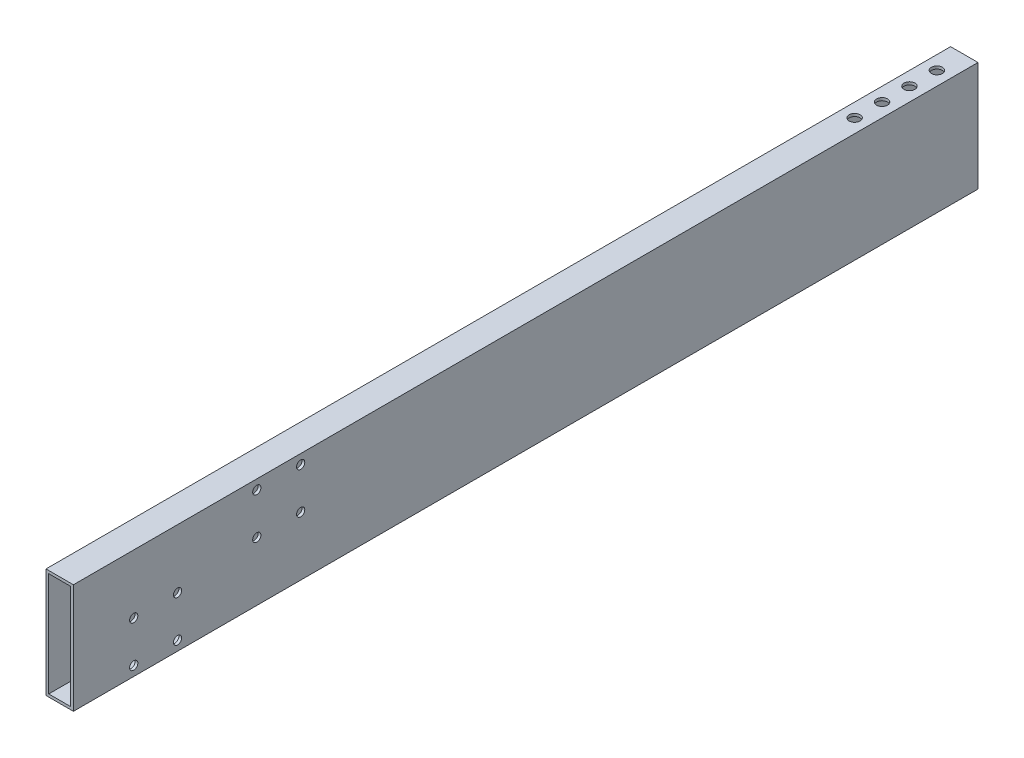
ISO-10303-21;
HEADER;
FILE_DESCRIPTION(('STEP AP214'),'2;1');
FILE_NAME('part.step','',(''),(''),'','','');
FILE_SCHEMA(('AUTOMOTIVE_DESIGN { 1 0 10303 214 1 1 1 1 }'));
ENDSEC;
DATA;
#1=APPLICATION_CONTEXT('core data for automotive mechanical design processes');
#2=APPLICATION_PROTOCOL_DEFINITION('international standard','automotive_design',2000,#1);
#3=PRODUCT_CONTEXT('',#1,'mechanical');
#4=PRODUCT('Part','Part','',(#3));
#5=PRODUCT_RELATED_PRODUCT_CATEGORY('part','',(#4));
#6=PRODUCT_DEFINITION_FORMATION('','',#4);
#7=PRODUCT_DEFINITION_CONTEXT('part definition',#1,'design');
#8=PRODUCT_DEFINITION('design','',#6,#7);
#9=PRODUCT_DEFINITION_SHAPE('','',#8);
#10=(LENGTH_UNIT() NAMED_UNIT(*) SI_UNIT(.MILLI.,.METRE.));
#11=(NAMED_UNIT(*) PLANE_ANGLE_UNIT() SI_UNIT($,.RADIAN.));
#12=(NAMED_UNIT(*) SI_UNIT($,.STERADIAN.) SOLID_ANGLE_UNIT());
#13=UNCERTAINTY_MEASURE_WITH_UNIT(LENGTH_MEASURE(1.E-05),#10,'distance_accuracy_value','');
#14=(GEOMETRIC_REPRESENTATION_CONTEXT(3) GLOBAL_UNCERTAINTY_ASSIGNED_CONTEXT((#13)) GLOBAL_UNIT_ASSIGNED_CONTEXT((#10,
#11,#12)) REPRESENTATION_CONTEXT('',''));
#15=CARTESIAN_POINT('',(0.,0.,0.));
#16=DIRECTION('',(0.,0.,1.));
#17=DIRECTION('',(1.,0.,0.));
#18=AXIS2_PLACEMENT_3D('',#15,#16,#17);
#19=CARTESIAN_POINT('',(0.,0.,330.));
#20=DIRECTION('',(0.,0.,-1.));
#21=DIRECTION('',(-1.,0.,0.));
#22=AXIS2_PLACEMENT_3D('',#19,#20,#21);
#23=PLANE('',#22);
#24=DIRECTION('',(0.,-1.,0.));
#25=VECTOR('',#24,1.);
#26=CARTESIAN_POINT('',(0.,0.,330.));
#27=LINE('',#26,#25);
#28=CARTESIAN_POINT('',(0.,40.,330.));
#29=VERTEX_POINT('',#28);
#30=CARTESIAN_POINT('',(0.,0.,330.));
#31=VERTEX_POINT('',#30);
#32=EDGE_CURVE('E157',#29,#31,#27,.T.);
#33=ORIENTED_EDGE('',*,*,#32,.T.);
#34=DIRECTION('',(1.,0.,0.));
#35=VECTOR('',#34,1.);
#36=CARTESIAN_POINT('',(0.,0.,330.));
#37=LINE('',#36,#35);
#38=CARTESIAN_POINT('',(10.,0.,330.));
#39=VERTEX_POINT('',#38);
#40=EDGE_CURVE('E161',#31,#39,#37,.T.);
#41=ORIENTED_EDGE('',*,*,#40,.T.);
#42=DIRECTION('',(0.,1.,0.));
#43=VECTOR('',#42,1.);
#44=CARTESIAN_POINT('',(10.,0.,330.));
#45=LINE('',#44,#43);
#46=CARTESIAN_POINT('',(10.,40.,330.));
#47=VERTEX_POINT('',#46);
#48=EDGE_CURVE('E165',#39,#47,#45,.T.);
#49=ORIENTED_EDGE('',*,*,#48,.T.);
#50=DIRECTION('',(-1.,0.,0.));
#51=VECTOR('',#50,1.);
#52=CARTESIAN_POINT('',(0.,40.,330.));
#53=LINE('',#52,#51);
#54=EDGE_CURVE('E168',#47,#29,#53,.T.);
#55=ORIENTED_EDGE('',*,*,#54,.T.);
#56=EDGE_LOOP('',(#33,#41,#49,#55));
#57=FACE_BOUND('',#56,.T.);
#58=DIRECTION('',(0.,-1.,0.));
#59=VECTOR('',#58,1.);
#60=CARTESIAN_POINT('',(1.,1.,330.));
#61=LINE('',#60,#59);
#62=CARTESIAN_POINT('',(1.,39.,330.));
#63=VERTEX_POINT('',#62);
#64=CARTESIAN_POINT('',(1.,1.,330.));
#65=VERTEX_POINT('',#64);
#66=EDGE_CURVE('E107',#63,#65,#61,.T.);
#67=ORIENTED_EDGE('',*,*,#66,.F.);
#68=DIRECTION('',(-1.,0.,0.));
#69=VECTOR('',#68,1.);
#70=CARTESIAN_POINT('',(1.,39.,330.));
#71=LINE('',#70,#69);
#72=CARTESIAN_POINT('',(9.,39.,330.));
#73=VERTEX_POINT('',#72);
#74=EDGE_CURVE('E133',#73,#63,#71,.T.);
#75=ORIENTED_EDGE('',*,*,#74,.F.);
#76=DIRECTION('',(0.,1.,0.));
#77=VECTOR('',#76,1.);
#78=CARTESIAN_POINT('',(9.,1.,330.));
#79=LINE('',#78,#77);
#80=CARTESIAN_POINT('',(9.,1.,330.));
#81=VERTEX_POINT('',#80);
#82=EDGE_CURVE('E129',#81,#73,#79,.T.);
#83=ORIENTED_EDGE('',*,*,#82,.F.);
#84=DIRECTION('',(1.,0.,0.));
#85=VECTOR('',#84,1.);
#86=CARTESIAN_POINT('',(1.,1.,330.));
#87=LINE('',#86,#85);
#88=EDGE_CURVE('E116',#65,#81,#87,.T.);
#89=ORIENTED_EDGE('',*,*,#88,.F.);
#90=EDGE_LOOP('',(#67,#75,#83,#89));
#91=FACE_BOUND('',#90,.T.);
#92=ADVANCED_FACE('F39',(#57,#91),#23,.F.);
#93=CARTESIAN_POINT('',(0.,0.,0.));
#94=DIRECTION('',(0.,0.,-1.));
#95=DIRECTION('',(-1.,0.,0.));
#96=AXIS2_PLACEMENT_3D('',#93,#94,#95);
#97=PLANE('',#96);
#98=DIRECTION('',(0.,-1.,0.));
#99=VECTOR('',#98,1.);
#100=CARTESIAN_POINT('',(0.,0.,0.));
#101=LINE('',#100,#99);
#102=CARTESIAN_POINT('',(0.,40.,0.));
#103=VERTEX_POINT('',#102);
#104=CARTESIAN_POINT('',(0.,0.,0.));
#105=VERTEX_POINT('',#104);
#106=EDGE_CURVE('E125',#103,#105,#101,.T.);
#107=ORIENTED_EDGE('',*,*,#106,.F.);
#108=DIRECTION('',(-1.,0.,0.));
#109=VECTOR('',#108,1.);
#110=CARTESIAN_POINT('',(0.,40.,0.));
#111=LINE('',#110,#109);
#112=CARTESIAN_POINT('',(10.,40.,0.));
#113=VERTEX_POINT('',#112);
#114=EDGE_CURVE('E162',#113,#103,#111,.T.);
#115=ORIENTED_EDGE('',*,*,#114,.F.);
#116=DIRECTION('',(0.,1.,0.));
#117=VECTOR('',#116,1.);
#118=CARTESIAN_POINT('',(10.,0.,0.));
#119=LINE('',#118,#117);
#120=CARTESIAN_POINT('',(10.,0.,0.));
#121=VERTEX_POINT('',#120);
#122=EDGE_CURVE('E178',#121,#113,#119,.T.);
#123=ORIENTED_EDGE('',*,*,#122,.F.);
#124=DIRECTION('',(1.,0.,0.));
#125=VECTOR('',#124,1.);
#126=CARTESIAN_POINT('',(0.,0.,0.));
#127=LINE('',#126,#125);
#128=EDGE_CURVE('E175',#105,#121,#127,.T.);
#129=ORIENTED_EDGE('',*,*,#128,.F.);
#130=EDGE_LOOP('',(#107,#115,#123,#129));
#131=FACE_BOUND('',#130,.T.);
#132=DIRECTION('',(-1.,0.,0.));
#133=VECTOR('',#132,1.);
#134=CARTESIAN_POINT('',(1.,39.,0.));
#135=LINE('',#134,#133);
#136=CARTESIAN_POINT('',(9.,39.,0.));
#137=VERTEX_POINT('',#136);
#138=CARTESIAN_POINT('',(1.,39.,0.));
#139=VERTEX_POINT('',#138);
#140=EDGE_CURVE('E117',#137,#139,#135,.T.);
#141=ORIENTED_EDGE('',*,*,#140,.T.);
#142=DIRECTION('',(0.,-1.,0.));
#143=VECTOR('',#142,1.);
#144=CARTESIAN_POINT('',(1.,1.,0.));
#145=LINE('',#144,#143);
#146=CARTESIAN_POINT('',(1.,1.,0.));
#147=VERTEX_POINT('',#146);
#148=EDGE_CURVE('E65',#139,#147,#145,.T.);
#149=ORIENTED_EDGE('',*,*,#148,.T.);
#150=DIRECTION('',(1.,0.,0.));
#151=VECTOR('',#150,1.);
#152=CARTESIAN_POINT('',(1.,1.,0.));
#153=LINE('',#152,#151);
#154=CARTESIAN_POINT('',(9.,1.,0.));
#155=VERTEX_POINT('',#154);
#156=EDGE_CURVE('E123',#147,#155,#153,.T.);
#157=ORIENTED_EDGE('',*,*,#156,.T.);
#158=DIRECTION('',(0.,1.,0.));
#159=VECTOR('',#158,1.);
#160=CARTESIAN_POINT('',(9.,1.,0.));
#161=LINE('',#160,#159);
#162=EDGE_CURVE('E144',#155,#137,#161,.T.);
#163=ORIENTED_EDGE('',*,*,#162,.T.);
#164=EDGE_LOOP('',(#141,#149,#157,#163));
#165=FACE_BOUND('',#164,.T.);
#166=ADVANCED_FACE('F396',(#131,#165),#97,.T.);
#167=CARTESIAN_POINT('',(0.,0.,330.));
#168=DIRECTION('',(1.,0.,0.));
#169=DIRECTION('',(0.,0.,-1.));
#170=AXIS2_PLACEMENT_3D('',#167,#168,#169);
#171=PLANE('',#170);
#172=CARTESIAN_POINT('',(0.,36.5,263.1));
#173=DIRECTION('',(1.,0.,0.));
#174=DIRECTION('',(0.,0.,-1.));
#175=AXIS2_PLACEMENT_3D('',#172,#173,#174);
#176=CIRCLE('',#175,1.50000000000002);
#177=CARTESIAN_POINT('',(0.,36.5,261.6));
#178=VERTEX_POINT('',#177);
#179=EDGE_CURVE('E310',#178,#178,#176,.T.);
#180=ORIENTED_EDGE('',*,*,#179,.T.);
#181=EDGE_LOOP('',(#180));
#182=FACE_BOUND('',#181,.T.);
#183=CARTESIAN_POINT('',(0.,3.5,308.));
#184=DIRECTION('',(1.,0.,0.));
#185=DIRECTION('',(0.,0.,-1.));
#186=AXIS2_PLACEMENT_3D('',#183,#184,#185);
#187=CIRCLE('',#186,1.50000000000002);
#188=CARTESIAN_POINT('',(0.,3.5,306.5));
#189=VERTEX_POINT('',#188);
#190=EDGE_CURVE('E301',#189,#189,#187,.T.);
#191=ORIENTED_EDGE('',*,*,#190,.T.);
#192=EDGE_LOOP('',(#191));
#193=FACE_BOUND('',#192,.T.);
#194=CARTESIAN_POINT('',(0.,18.5,292.));
#195=DIRECTION('',(1.,0.,0.));
#196=DIRECTION('',(0.,0.,-1.));
#197=AXIS2_PLACEMENT_3D('',#194,#195,#196);
#198=CIRCLE('',#197,1.50000000000002);
#199=CARTESIAN_POINT('',(0.,18.5,290.5));
#200=VERTEX_POINT('',#199);
#201=EDGE_CURVE('E326',#200,#200,#198,.T.);
#202=ORIENTED_EDGE('',*,*,#201,.T.);
#203=EDGE_LOOP('',(#202));
#204=FACE_BOUND('',#203,.T.);
#205=CARTESIAN_POINT('',(0.,3.5,292.));
#206=DIRECTION('',(1.,0.,0.));
#207=DIRECTION('',(0.,0.,-1.));
#208=AXIS2_PLACEMENT_3D('',#205,#206,#207);
#209=CIRCLE('',#208,1.50000000000002);
#210=CARTESIAN_POINT('',(0.,3.5,290.5));
#211=VERTEX_POINT('',#210);
#212=EDGE_CURVE('E317',#211,#211,#209,.T.);
#213=ORIENTED_EDGE('',*,*,#212,.T.);
#214=EDGE_LOOP('',(#213));
#215=FACE_BOUND('',#214,.T.);
#216=CARTESIAN_POINT('',(0.,21.5,247.1));
#217=DIRECTION('',(1.,0.,0.));
#218=DIRECTION('',(0.,0.,-1.));
#219=AXIS2_PLACEMENT_3D('',#216,#217,#218);
#220=CIRCLE('',#219,1.5);
#221=CARTESIAN_POINT('',(0.,21.5,245.6));
#222=VERTEX_POINT('',#221);
#223=EDGE_CURVE('E277',#222,#222,#220,.T.);
#224=ORIENTED_EDGE('',*,*,#223,.T.);
#225=EDGE_LOOP('',(#224));
#226=FACE_BOUND('',#225,.T.);
#227=CARTESIAN_POINT('',(0.,21.5,263.1));
#228=DIRECTION('',(1.,0.,0.));
#229=DIRECTION('',(0.,0.,-1.));
#230=AXIS2_PLACEMENT_3D('',#227,#228,#229);
#231=CIRCLE('',#230,1.50000000000002);
#232=CARTESIAN_POINT('',(0.,21.5,261.6));
#233=VERTEX_POINT('',#232);
#234=EDGE_CURVE('E294',#233,#233,#231,.T.);
#235=ORIENTED_EDGE('',*,*,#234,.T.);
#236=EDGE_LOOP('',(#235));
#237=FACE_BOUND('',#236,.T.);
#238=CARTESIAN_POINT('',(0.,36.5,247.1));
#239=DIRECTION('',(1.,0.,0.));
#240=DIRECTION('',(0.,0.,-1.));
#241=AXIS2_PLACEMENT_3D('',#238,#239,#240);
#242=CIRCLE('',#241,1.5);
#243=CARTESIAN_POINT('',(0.,36.5,245.6));
#244=VERTEX_POINT('',#243);
#245=EDGE_CURVE('E285',#244,#244,#242,.T.);
#246=ORIENTED_EDGE('',*,*,#245,.T.);
#247=EDGE_LOOP('',(#246));
#248=FACE_BOUND('',#247,.T.);
#249=CARTESIAN_POINT('',(0.,18.5,308.));
#250=DIRECTION('',(1.,0.,0.));
#251=DIRECTION('',(0.,0.,-1.));
#252=AXIS2_PLACEMENT_3D('',#249,#250,#251);
#253=CIRCLE('',#252,1.50000000000002);
#254=CARTESIAN_POINT('',(0.,18.5,306.5));
#255=VERTEX_POINT('',#254);
#256=EDGE_CURVE('E198',#255,#255,#253,.T.);
#257=ORIENTED_EDGE('',*,*,#256,.T.);
#258=EDGE_LOOP('',(#257));
#259=FACE_BOUND('',#258,.T.);
#260=ORIENTED_EDGE('',*,*,#106,.T.);
#261=DIRECTION('',(0.,0.,-1.));
#262=VECTOR('',#261,1.);
#263=CARTESIAN_POINT('',(0.,0.,330.));
#264=LINE('',#263,#262);
#265=EDGE_CURVE('E11',#31,#105,#264,.T.);
#266=ORIENTED_EDGE('',*,*,#265,.F.);
#267=ORIENTED_EDGE('',*,*,#32,.F.);
#268=DIRECTION('',(0.,0.,-1.));
#269=VECTOR('',#268,1.);
#270=CARTESIAN_POINT('',(0.,40.,330.));
#271=LINE('',#270,#269);
#272=EDGE_CURVE('E171',#29,#103,#271,.T.);
#273=ORIENTED_EDGE('',*,*,#272,.T.);
#274=EDGE_LOOP('',(#260,#266,#267,#273));
#275=FACE_BOUND('',#274,.T.);
#276=ADVANCED_FACE('F41',(#182,#193,#204,#215,#226,#237,#248,#259,#275),#171,.F.);
#277=CARTESIAN_POINT('',(0.,0.,330.));
#278=DIRECTION('',(0.,1.,0.));
#279=DIRECTION('',(0.,0.,1.));
#280=AXIS2_PLACEMENT_3D('',#277,#278,#279);
#281=PLANE('',#280);
#282=CARTESIAN_POINT('',(5.,0.,10.));
#283=DIRECTION('',(0.,1.,0.));
#284=DIRECTION('',(0.,0.,1.));
#285=AXIS2_PLACEMENT_3D('',#282,#283,#284);
#286=CIRCLE('',#285,2.);
#287=CARTESIAN_POINT('',(5.,0.,12.));
#288=VERTEX_POINT('',#287);
#289=EDGE_CURVE('E238',#288,#288,#286,.T.);
#290=ORIENTED_EDGE('',*,*,#289,.T.);
#291=EDGE_LOOP('',(#290));
#292=FACE_BOUND('',#291,.T.);
#293=CARTESIAN_POINT('',(5.0000000000001,0.,20.));
#294=DIRECTION('',(0.,1.,0.));
#295=DIRECTION('',(0.,0.,1.));
#296=AXIS2_PLACEMENT_3D('',#293,#294,#295);
#297=CIRCLE('',#296,2.);
#298=CARTESIAN_POINT('',(5.0000000000001,0.,22.));
#299=VERTEX_POINT('',#298);
#300=EDGE_CURVE('E514',#299,#299,#297,.T.);
#301=ORIENTED_EDGE('',*,*,#300,.T.);
#302=EDGE_LOOP('',(#301));
#303=FACE_BOUND('',#302,.T.);
#304=CARTESIAN_POINT('',(5.00000000000021,0.,30.));
#305=DIRECTION('',(0.,1.,0.));
#306=DIRECTION('',(0.,0.,1.));
#307=AXIS2_PLACEMENT_3D('',#304,#305,#306);
#308=CIRCLE('',#307,2.);
#309=CARTESIAN_POINT('',(5.00000000000021,0.,32.));
#310=VERTEX_POINT('',#309);
#311=EDGE_CURVE('E518',#310,#310,#308,.T.);
#312=ORIENTED_EDGE('',*,*,#311,.T.);
#313=EDGE_LOOP('',(#312));
#314=FACE_BOUND('',#313,.T.);
#315=CARTESIAN_POINT('',(5.00000000000031,0.,40.));
#316=DIRECTION('',(0.,1.,0.));
#317=DIRECTION('',(0.,0.,1.));
#318=AXIS2_PLACEMENT_3D('',#315,#316,#317);
#319=CIRCLE('',#318,2.);
#320=CARTESIAN_POINT('',(5.00000000000031,0.,42.));
#321=VERTEX_POINT('',#320);
#322=EDGE_CURVE('E524',#321,#321,#319,.T.);
#323=ORIENTED_EDGE('',*,*,#322,.T.);
#324=EDGE_LOOP('',(#323));
#325=FACE_BOUND('',#324,.T.);
#326=ORIENTED_EDGE('',*,*,#128,.T.);
#327=DIRECTION('',(0.,0.,-1.));
#328=VECTOR('',#327,1.);
#329=CARTESIAN_POINT('',(10.,0.,330.));
#330=LINE('',#329,#328);
#331=EDGE_CURVE('E49',#39,#121,#330,.T.);
#332=ORIENTED_EDGE('',*,*,#331,.F.);
#333=ORIENTED_EDGE('',*,*,#40,.F.);
#334=ORIENTED_EDGE('',*,*,#265,.T.);
#335=EDGE_LOOP('',(#326,#332,#333,#334));
#336=FACE_BOUND('',#335,.T.);
#337=ADVANCED_FACE('F395',(#292,#303,#314,#325,#336),#281,.F.);
#338=CARTESIAN_POINT('',(10.,0.,330.));
#339=DIRECTION('',(-1.,0.,0.));
#340=DIRECTION('',(0.,0.,1.));
#341=AXIS2_PLACEMENT_3D('',#338,#339,#340);
#342=PLANE('',#341);
#343=CARTESIAN_POINT('',(10.,36.5,263.1));
#344=DIRECTION('',(1.,0.,0.));
#345=DIRECTION('',(0.,0.,-1.));
#346=AXIS2_PLACEMENT_3D('',#343,#344,#345);
#347=CIRCLE('',#346,1.50000000000002);
#348=CARTESIAN_POINT('',(10.,36.5,261.6));
#349=VERTEX_POINT('',#348);
#350=EDGE_CURVE('E289',#349,#349,#347,.T.);
#351=ORIENTED_EDGE('',*,*,#350,.F.);
#352=EDGE_LOOP('',(#351));
#353=FACE_BOUND('',#352,.T.);
#354=CARTESIAN_POINT('',(10.,3.5,308.));
#355=DIRECTION('',(1.,0.,0.));
#356=DIRECTION('',(0.,0.,-1.));
#357=AXIS2_PLACEMENT_3D('',#354,#355,#356);
#358=CIRCLE('',#357,1.50000000000002);
#359=CARTESIAN_POINT('',(10.,3.5,306.5));
#360=VERTEX_POINT('',#359);
#361=EDGE_CURVE('E306',#360,#360,#358,.T.);
#362=ORIENTED_EDGE('',*,*,#361,.F.);
#363=EDGE_LOOP('',(#362));
#364=FACE_BOUND('',#363,.T.);
#365=CARTESIAN_POINT('',(10.,18.5,292.));
#366=DIRECTION('',(1.,0.,0.));
#367=DIRECTION('',(0.,0.,-1.));
#368=AXIS2_PLACEMENT_3D('',#365,#366,#367);
#369=CIRCLE('',#368,1.50000000000002);
#370=CARTESIAN_POINT('',(10.,18.5,290.5));
#371=VERTEX_POINT('',#370);
#372=EDGE_CURVE('E305',#371,#371,#369,.T.);
#373=ORIENTED_EDGE('',*,*,#372,.F.);
#374=EDGE_LOOP('',(#373));
#375=FACE_BOUND('',#374,.T.);
#376=CARTESIAN_POINT('',(10.,3.5,292.));
#377=DIRECTION('',(1.,0.,0.));
#378=DIRECTION('',(0.,0.,-1.));
#379=AXIS2_PLACEMENT_3D('',#376,#377,#378);
#380=CIRCLE('',#379,1.50000000000002);
#381=CARTESIAN_POINT('',(10.,3.5,290.5));
#382=VERTEX_POINT('',#381);
#383=EDGE_CURVE('E322',#382,#382,#380,.T.);
#384=ORIENTED_EDGE('',*,*,#383,.F.);
#385=EDGE_LOOP('',(#384));
#386=FACE_BOUND('',#385,.T.);
#387=CARTESIAN_POINT('',(10.,21.5,247.1));
#388=DIRECTION('',(1.,0.,0.));
#389=DIRECTION('',(0.,0.,-1.));
#390=AXIS2_PLACEMENT_3D('',#387,#388,#389);
#391=CIRCLE('',#390,1.5);
#392=CARTESIAN_POINT('',(10.,21.5,245.6));
#393=VERTEX_POINT('',#392);
#394=EDGE_CURVE('E276',#393,#393,#391,.T.);
#395=ORIENTED_EDGE('',*,*,#394,.F.);
#396=EDGE_LOOP('',(#395));
#397=FACE_BOUND('',#396,.T.);
#398=CARTESIAN_POINT('',(10.,21.5,263.1));
#399=DIRECTION('',(1.,0.,0.));
#400=DIRECTION('',(0.,0.,-1.));
#401=AXIS2_PLACEMENT_3D('',#398,#399,#400);
#402=CIRCLE('',#401,1.50000000000002);
#403=CARTESIAN_POINT('',(10.,21.5,261.6));
#404=VERTEX_POINT('',#403);
#405=EDGE_CURVE('E281',#404,#404,#402,.T.);
#406=ORIENTED_EDGE('',*,*,#405,.F.);
#407=EDGE_LOOP('',(#406));
#408=FACE_BOUND('',#407,.T.);
#409=CARTESIAN_POINT('',(10.,36.5,247.1));
#410=DIRECTION('',(1.,0.,0.));
#411=DIRECTION('',(0.,0.,-1.));
#412=AXIS2_PLACEMENT_3D('',#409,#410,#411);
#413=CIRCLE('',#412,1.5);
#414=CARTESIAN_POINT('',(10.,36.5,245.6));
#415=VERTEX_POINT('',#414);
#416=EDGE_CURVE('E290',#415,#415,#413,.T.);
#417=ORIENTED_EDGE('',*,*,#416,.F.);
#418=EDGE_LOOP('',(#417));
#419=FACE_BOUND('',#418,.T.);
#420=CARTESIAN_POINT('',(10.,18.5,308.));
#421=DIRECTION('',(1.,0.,0.));
#422=DIRECTION('',(0.,0.,-1.));
#423=AXIS2_PLACEMENT_3D('',#420,#421,#422);
#424=CIRCLE('',#423,1.50000000000002);
#425=CARTESIAN_POINT('',(10.,18.5,306.5));
#426=VERTEX_POINT('',#425);
#427=EDGE_CURVE('E321',#426,#426,#424,.T.);
#428=ORIENTED_EDGE('',*,*,#427,.F.);
#429=EDGE_LOOP('',(#428));
#430=FACE_BOUND('',#429,.T.);
#431=ORIENTED_EDGE('',*,*,#122,.T.);
#432=DIRECTION('',(0.,0.,-1.));
#433=VECTOR('',#432,1.);
#434=CARTESIAN_POINT('',(10.,40.,330.));
#435=LINE('',#434,#433);
#436=EDGE_CURVE('E186',#47,#113,#435,.T.);
#437=ORIENTED_EDGE('',*,*,#436,.F.);
#438=ORIENTED_EDGE('',*,*,#48,.F.);
#439=ORIENTED_EDGE('',*,*,#331,.T.);
#440=EDGE_LOOP('',(#431,#437,#438,#439));
#441=FACE_BOUND('',#440,.T.);
#442=ADVANCED_FACE('F414',(#353,#364,#375,#386,#397,#408,#419,#430,#441),#342,.F.);
#443=CARTESIAN_POINT('',(0.,40.,330.));
#444=DIRECTION('',(0.,-1.,0.));
#445=DIRECTION('',(0.,0.,-1.));
#446=AXIS2_PLACEMENT_3D('',#443,#444,#445);
#447=PLANE('',#446);
#448=CARTESIAN_POINT('',(5.,40.,10.));
#449=DIRECTION('',(0.,-1.,0.));
#450=DIRECTION('',(0.,0.,-1.));
#451=AXIS2_PLACEMENT_3D('',#448,#449,#450);
#452=CIRCLE('',#451,2.);
#453=CARTESIAN_POINT('',(5.,40.,8.));
#454=VERTEX_POINT('',#453);
#455=EDGE_CURVE('E272',#454,#454,#452,.T.);
#456=ORIENTED_EDGE('',*,*,#455,.T.);
#457=EDGE_LOOP('',(#456));
#458=FACE_BOUND('',#457,.T.);
#459=CARTESIAN_POINT('',(5.0000000000001,40.,20.));
#460=DIRECTION('',(0.,-1.,0.));
#461=DIRECTION('',(0.,0.,-1.));
#462=AXIS2_PLACEMENT_3D('',#459,#460,#461);
#463=CIRCLE('',#462,2.);
#464=CARTESIAN_POINT('',(5.0000000000001,40.,18.));
#465=VERTEX_POINT('',#464);
#466=EDGE_CURVE('E254',#465,#465,#463,.T.);
#467=ORIENTED_EDGE('',*,*,#466,.T.);
#468=EDGE_LOOP('',(#467));
#469=FACE_BOUND('',#468,.T.);
#470=CARTESIAN_POINT('',(5.00000000000021,40.,30.));
#471=DIRECTION('',(0.,-1.,0.));
#472=DIRECTION('',(0.,0.,-1.));
#473=AXIS2_PLACEMENT_3D('',#470,#471,#472);
#474=CIRCLE('',#473,2.);
#475=CARTESIAN_POINT('',(5.00000000000021,40.,28.));
#476=VERTEX_POINT('',#475);
#477=EDGE_CURVE('E248',#476,#476,#474,.T.);
#478=ORIENTED_EDGE('',*,*,#477,.T.);
#479=EDGE_LOOP('',(#478));
#480=FACE_BOUND('',#479,.T.);
#481=CARTESIAN_POINT('',(5.00000000000031,40.,40.));
#482=DIRECTION('',(0.,-1.,0.));
#483=DIRECTION('',(0.,0.,-1.));
#484=AXIS2_PLACEMENT_3D('',#481,#482,#483);
#485=CIRCLE('',#484,2.);
#486=CARTESIAN_POINT('',(5.00000000000031,40.,38.));
#487=VERTEX_POINT('',#486);
#488=EDGE_CURVE('E243',#487,#487,#485,.T.);
#489=ORIENTED_EDGE('',*,*,#488,.T.);
#490=EDGE_LOOP('',(#489));
#491=FACE_BOUND('',#490,.T.);
#492=ORIENTED_EDGE('',*,*,#114,.T.);
#493=ORIENTED_EDGE('',*,*,#272,.F.);
#494=ORIENTED_EDGE('',*,*,#54,.F.);
#495=ORIENTED_EDGE('',*,*,#436,.T.);
#496=EDGE_LOOP('',(#492,#493,#494,#495));
#497=FACE_BOUND('',#496,.T.);
#498=ADVANCED_FACE('F368',(#458,#469,#480,#491,#497),#447,.F.);
#499=CARTESIAN_POINT('',(1.,1.,330.));
#500=DIRECTION('',(1.,0.,0.));
#501=DIRECTION('',(0.,0.,-1.));
#502=AXIS2_PLACEMENT_3D('',#499,#500,#501);
#503=PLANE('',#502);
#504=CARTESIAN_POINT('',(1.,36.5,263.1));
#505=DIRECTION('',(1.,0.,0.));
#506=DIRECTION('',(0.,0.,-1.));
#507=AXIS2_PLACEMENT_3D('',#504,#505,#506);
#508=CIRCLE('',#507,1.50000000000002);
#509=CARTESIAN_POINT('',(1.,36.5,261.6));
#510=VERTEX_POINT('',#509);
#511=EDGE_CURVE('E141',#510,#510,#508,.T.);
#512=ORIENTED_EDGE('',*,*,#511,.F.);
#513=EDGE_LOOP('',(#512));
#514=FACE_BOUND('',#513,.T.);
#515=CARTESIAN_POINT('',(1.,3.5,308.));
#516=DIRECTION('',(1.,0.,0.));
#517=DIRECTION('',(0.,0.,-1.));
#518=AXIS2_PLACEMENT_3D('',#515,#516,#517);
#519=CIRCLE('',#518,1.50000000000002);
#520=CARTESIAN_POINT('',(1.,3.5,306.5));
#521=VERTEX_POINT('',#520);
#522=EDGE_CURVE('E228',#521,#521,#519,.T.);
#523=ORIENTED_EDGE('',*,*,#522,.F.);
#524=EDGE_LOOP('',(#523));
#525=FACE_BOUND('',#524,.T.);
#526=CARTESIAN_POINT('',(1.,18.5,292.));
#527=DIRECTION('',(1.,0.,0.));
#528=DIRECTION('',(0.,0.,-1.));
#529=AXIS2_PLACEMENT_3D('',#526,#527,#528);
#530=CIRCLE('',#529,1.50000000000002);
#531=CARTESIAN_POINT('',(1.,18.5,290.5));
#532=VERTEX_POINT('',#531);
#533=EDGE_CURVE('E223',#532,#532,#530,.T.);
#534=ORIENTED_EDGE('',*,*,#533,.F.);
#535=EDGE_LOOP('',(#534));
#536=FACE_BOUND('',#535,.T.);
#537=CARTESIAN_POINT('',(1.,3.5,292.));
#538=DIRECTION('',(1.,0.,0.));
#539=DIRECTION('',(0.,0.,-1.));
#540=AXIS2_PLACEMENT_3D('',#537,#538,#539);
#541=CIRCLE('',#540,1.50000000000002);
#542=CARTESIAN_POINT('',(1.,3.5,290.5));
#543=VERTEX_POINT('',#542);
#544=EDGE_CURVE('E218',#543,#543,#541,.T.);
#545=ORIENTED_EDGE('',*,*,#544,.F.);
#546=EDGE_LOOP('',(#545));
#547=FACE_BOUND('',#546,.T.);
#548=CARTESIAN_POINT('',(1.,21.5,247.1));
#549=DIRECTION('',(1.,0.,0.));
#550=DIRECTION('',(0.,0.,-1.));
#551=AXIS2_PLACEMENT_3D('',#548,#549,#550);
#552=CIRCLE('',#551,1.5);
#553=CARTESIAN_POINT('',(1.,21.5,245.6));
#554=VERTEX_POINT('',#553);
#555=EDGE_CURVE('E213',#554,#554,#552,.T.);
#556=ORIENTED_EDGE('',*,*,#555,.F.);
#557=EDGE_LOOP('',(#556));
#558=FACE_BOUND('',#557,.T.);
#559=CARTESIAN_POINT('',(1.,21.5,263.1));
#560=DIRECTION('',(1.,0.,0.));
#561=DIRECTION('',(0.,0.,-1.));
#562=AXIS2_PLACEMENT_3D('',#559,#560,#561);
#563=CIRCLE('',#562,1.50000000000002);
#564=CARTESIAN_POINT('',(1.,21.5,261.6));
#565=VERTEX_POINT('',#564);
#566=EDGE_CURVE('E208',#565,#565,#563,.T.);
#567=ORIENTED_EDGE('',*,*,#566,.F.);
#568=EDGE_LOOP('',(#567));
#569=FACE_BOUND('',#568,.T.);
#570=CARTESIAN_POINT('',(1.,36.5,247.1));
#571=DIRECTION('',(1.,0.,0.));
#572=DIRECTION('',(0.,0.,-1.));
#573=AXIS2_PLACEMENT_3D('',#570,#571,#572);
#574=CIRCLE('',#573,1.5);
#575=CARTESIAN_POINT('',(1.,36.5,245.6));
#576=VERTEX_POINT('',#575);
#577=EDGE_CURVE('E203',#576,#576,#574,.T.);
#578=ORIENTED_EDGE('',*,*,#577,.F.);
#579=EDGE_LOOP('',(#578));
#580=FACE_BOUND('',#579,.T.);
#581=CARTESIAN_POINT('',(1.,18.5,308.));
#582=DIRECTION('',(1.,0.,0.));
#583=DIRECTION('',(0.,0.,-1.));
#584=AXIS2_PLACEMENT_3D('',#581,#582,#583);
#585=CIRCLE('',#584,1.50000000000002);
#586=CARTESIAN_POINT('',(1.,18.5,306.5));
#587=VERTEX_POINT('',#586);
#588=EDGE_CURVE('E197',#587,#587,#585,.T.);
#589=ORIENTED_EDGE('',*,*,#588,.F.);
#590=EDGE_LOOP('',(#589));
#591=FACE_BOUND('',#590,.T.);
#592=ORIENTED_EDGE('',*,*,#148,.F.);
#593=DIRECTION('',(0.,0.,-1.));
#594=VECTOR('',#593,1.);
#595=CARTESIAN_POINT('',(1.,39.,330.));
#596=LINE('',#595,#594);
#597=EDGE_CURVE('E111',#63,#139,#596,.T.);
#598=ORIENTED_EDGE('',*,*,#597,.F.);
#599=ORIENTED_EDGE('',*,*,#66,.T.);
#600=DIRECTION('',(0.,0.,-1.));
#601=VECTOR('',#600,1.);
#602=CARTESIAN_POINT('',(1.,1.,330.));
#603=LINE('',#602,#601);
#604=EDGE_CURVE('E110',#65,#147,#603,.T.);
#605=ORIENTED_EDGE('',*,*,#604,.T.);
#606=EDGE_LOOP('',(#592,#598,#599,#605));
#607=FACE_BOUND('',#606,.T.);
#608=ADVANCED_FACE('F109',(#514,#525,#536,#547,#558,#569,#580,#591,#607),#503,.T.);
#609=CARTESIAN_POINT('',(1.,1.,330.));
#610=DIRECTION('',(0.,1.,0.));
#611=DIRECTION('',(0.,0.,1.));
#612=AXIS2_PLACEMENT_3D('',#609,#610,#611);
#613=PLANE('',#612);
#614=CARTESIAN_POINT('',(5.,1.,10.));
#615=DIRECTION('',(0.,1.,0.));
#616=DIRECTION('',(0.,0.,1.));
#617=AXIS2_PLACEMENT_3D('',#614,#615,#616);
#618=CIRCLE('',#617,2.);
#619=CARTESIAN_POINT('',(5.,1.,12.));
#620=VERTEX_POINT('',#619);
#621=EDGE_CURVE('E268',#620,#620,#618,.T.);
#622=ORIENTED_EDGE('',*,*,#621,.F.);
#623=EDGE_LOOP('',(#622));
#624=FACE_BOUND('',#623,.T.);
#625=CARTESIAN_POINT('',(5.0000000000001,1.,20.));
#626=DIRECTION('',(0.,1.,0.));
#627=DIRECTION('',(0.,0.,1.));
#628=AXIS2_PLACEMENT_3D('',#625,#626,#627);
#629=CIRCLE('',#628,2.);
#630=CARTESIAN_POINT('',(5.0000000000001,1.,22.));
#631=VERTEX_POINT('',#630);
#632=EDGE_CURVE('E247',#631,#631,#629,.T.);
#633=ORIENTED_EDGE('',*,*,#632,.F.);
#634=EDGE_LOOP('',(#633));
#635=FACE_BOUND('',#634,.T.);
#636=CARTESIAN_POINT('',(5.00000000000021,1.,30.));
#637=DIRECTION('',(0.,1.,0.));
#638=DIRECTION('',(0.,0.,1.));
#639=AXIS2_PLACEMENT_3D('',#636,#637,#638);
#640=CIRCLE('',#639,2.);
#641=CARTESIAN_POINT('',(5.00000000000021,1.,32.));
#642=VERTEX_POINT('',#641);
#643=EDGE_CURVE('E242',#642,#642,#640,.T.);
#644=ORIENTED_EDGE('',*,*,#643,.F.);
#645=EDGE_LOOP('',(#644));
#646=FACE_BOUND('',#645,.T.);
#647=CARTESIAN_POINT('',(5.00000000000031,1.,40.));
#648=DIRECTION('',(0.,1.,0.));
#649=DIRECTION('',(0.,0.,1.));
#650=AXIS2_PLACEMENT_3D('',#647,#648,#649);
#651=CIRCLE('',#650,2.);
#652=CARTESIAN_POINT('',(5.00000000000031,1.,42.));
#653=VERTEX_POINT('',#652);
#654=EDGE_CURVE('E237',#653,#653,#651,.T.);
#655=ORIENTED_EDGE('',*,*,#654,.F.);
#656=EDGE_LOOP('',(#655));
#657=FACE_BOUND('',#656,.T.);
#658=ORIENTED_EDGE('',*,*,#156,.F.);
#659=ORIENTED_EDGE('',*,*,#604,.F.);
#660=ORIENTED_EDGE('',*,*,#88,.T.);
#661=DIRECTION('',(0.,0.,-1.));
#662=VECTOR('',#661,1.);
#663=CARTESIAN_POINT('',(9.,1.,330.));
#664=LINE('',#663,#662);
#665=EDGE_CURVE('E126',#81,#155,#664,.T.);
#666=ORIENTED_EDGE('',*,*,#665,.T.);
#667=EDGE_LOOP('',(#658,#659,#660,#666));
#668=FACE_BOUND('',#667,.T.);
#669=ADVANCED_FACE('F120',(#624,#635,#646,#657,#668),#613,.T.);
#670=CARTESIAN_POINT('',(9.,1.,330.));
#671=DIRECTION('',(-1.,0.,0.));
#672=DIRECTION('',(0.,0.,1.));
#673=AXIS2_PLACEMENT_3D('',#670,#671,#672);
#674=PLANE('',#673);
#675=CARTESIAN_POINT('',(9.,36.5,263.1));
#676=DIRECTION('',(-1.,0.,0.));
#677=DIRECTION('',(0.,0.,1.));
#678=AXIS2_PLACEMENT_3D('',#675,#676,#677);
#679=CIRCLE('',#678,1.50000000000002);
#680=CARTESIAN_POINT('',(9.,36.5,264.6));
#681=VERTEX_POINT('',#680);
#682=EDGE_CURVE('E229',#681,#681,#679,.T.);
#683=ORIENTED_EDGE('',*,*,#682,.F.);
#684=EDGE_LOOP('',(#683));
#685=FACE_BOUND('',#684,.T.);
#686=CARTESIAN_POINT('',(9.,3.5,308.));
#687=DIRECTION('',(-1.,0.,0.));
#688=DIRECTION('',(0.,0.,1.));
#689=AXIS2_PLACEMENT_3D('',#686,#687,#688);
#690=CIRCLE('',#689,1.50000000000002);
#691=CARTESIAN_POINT('',(9.,3.5,309.5));
#692=VERTEX_POINT('',#691);
#693=EDGE_CURVE('E224',#692,#692,#690,.T.);
#694=ORIENTED_EDGE('',*,*,#693,.F.);
#695=EDGE_LOOP('',(#694));
#696=FACE_BOUND('',#695,.T.);
#697=CARTESIAN_POINT('',(9.,18.5,292.));
#698=DIRECTION('',(-1.,0.,0.));
#699=DIRECTION('',(0.,0.,1.));
#700=AXIS2_PLACEMENT_3D('',#697,#698,#699);
#701=CIRCLE('',#700,1.50000000000002);
#702=CARTESIAN_POINT('',(9.,18.5,293.5));
#703=VERTEX_POINT('',#702);
#704=EDGE_CURVE('E219',#703,#703,#701,.T.);
#705=ORIENTED_EDGE('',*,*,#704,.F.);
#706=EDGE_LOOP('',(#705));
#707=FACE_BOUND('',#706,.T.);
#708=CARTESIAN_POINT('',(9.,3.5,292.));
#709=DIRECTION('',(-1.,0.,0.));
#710=DIRECTION('',(0.,0.,1.));
#711=AXIS2_PLACEMENT_3D('',#708,#709,#710);
#712=CIRCLE('',#711,1.50000000000002);
#713=CARTESIAN_POINT('',(9.,3.5,293.5));
#714=VERTEX_POINT('',#713);
#715=EDGE_CURVE('E214',#714,#714,#712,.T.);
#716=ORIENTED_EDGE('',*,*,#715,.F.);
#717=EDGE_LOOP('',(#716));
#718=FACE_BOUND('',#717,.T.);
#719=CARTESIAN_POINT('',(9.,21.5,247.1));
#720=DIRECTION('',(-1.,0.,0.));
#721=DIRECTION('',(0.,0.,1.));
#722=AXIS2_PLACEMENT_3D('',#719,#720,#721);
#723=CIRCLE('',#722,1.5);
#724=CARTESIAN_POINT('',(9.,21.5,248.6));
#725=VERTEX_POINT('',#724);
#726=EDGE_CURVE('E209',#725,#725,#723,.T.);
#727=ORIENTED_EDGE('',*,*,#726,.F.);
#728=EDGE_LOOP('',(#727));
#729=FACE_BOUND('',#728,.T.);
#730=CARTESIAN_POINT('',(9.,21.5,263.1));
#731=DIRECTION('',(-1.,0.,0.));
#732=DIRECTION('',(0.,0.,1.));
#733=AXIS2_PLACEMENT_3D('',#730,#731,#732);
#734=CIRCLE('',#733,1.50000000000002);
#735=CARTESIAN_POINT('',(9.,21.5,264.6));
#736=VERTEX_POINT('',#735);
#737=EDGE_CURVE('E204',#736,#736,#734,.T.);
#738=ORIENTED_EDGE('',*,*,#737,.F.);
#739=EDGE_LOOP('',(#738));
#740=FACE_BOUND('',#739,.T.);
#741=CARTESIAN_POINT('',(9.,36.5,247.1));
#742=DIRECTION('',(-1.,0.,0.));
#743=DIRECTION('',(0.,0.,1.));
#744=AXIS2_PLACEMENT_3D('',#741,#742,#743);
#745=CIRCLE('',#744,1.5);
#746=CARTESIAN_POINT('',(9.,36.5,248.6));
#747=VERTEX_POINT('',#746);
#748=EDGE_CURVE('E199',#747,#747,#745,.T.);
#749=ORIENTED_EDGE('',*,*,#748,.F.);
#750=EDGE_LOOP('',(#749));
#751=FACE_BOUND('',#750,.T.);
#752=CARTESIAN_POINT('',(9.,18.5,308.));
#753=DIRECTION('',(-1.,0.,0.));
#754=DIRECTION('',(0.,0.,1.));
#755=AXIS2_PLACEMENT_3D('',#752,#753,#754);
#756=CIRCLE('',#755,1.50000000000002);
#757=CARTESIAN_POINT('',(9.,18.5,309.5));
#758=VERTEX_POINT('',#757);
#759=EDGE_CURVE('E193',#758,#758,#756,.T.);
#760=ORIENTED_EDGE('',*,*,#759,.F.);
#761=EDGE_LOOP('',(#760));
#762=FACE_BOUND('',#761,.T.);
#763=ORIENTED_EDGE('',*,*,#162,.F.);
#764=ORIENTED_EDGE('',*,*,#665,.F.);
#765=ORIENTED_EDGE('',*,*,#82,.T.);
#766=DIRECTION('',(0.,0.,-1.));
#767=VECTOR('',#766,1.);
#768=CARTESIAN_POINT('',(9.,39.,330.));
#769=LINE('',#768,#767);
#770=EDGE_CURVE('E57',#73,#137,#769,.T.);
#771=ORIENTED_EDGE('',*,*,#770,.T.);
#772=EDGE_LOOP('',(#763,#764,#765,#771));
#773=FACE_BOUND('',#772,.T.);
#774=ADVANCED_FACE('F436',(#685,#696,#707,#718,#729,#740,#751,#762,#773),#674,.T.);
#775=CARTESIAN_POINT('',(1.,39.,330.));
#776=DIRECTION('',(0.,-1.,0.));
#777=DIRECTION('',(0.,0.,-1.));
#778=AXIS2_PLACEMENT_3D('',#775,#776,#777);
#779=PLANE('',#778);
#780=CARTESIAN_POINT('',(5.,39.,10.));
#781=DIRECTION('',(0.,-1.,0.));
#782=DIRECTION('',(0.,0.,-1.));
#783=AXIS2_PLACEMENT_3D('',#780,#781,#782);
#784=CIRCLE('',#783,2.);
#785=CARTESIAN_POINT('',(5.,39.,8.));
#786=VERTEX_POINT('',#785);
#787=EDGE_CURVE('E43',#786,#786,#784,.T.);
#788=ORIENTED_EDGE('',*,*,#787,.F.);
#789=EDGE_LOOP('',(#788));
#790=FACE_BOUND('',#789,.T.);
#791=CARTESIAN_POINT('',(5.0000000000001,39.,20.));
#792=DIRECTION('',(0.,-1.,0.));
#793=DIRECTION('',(0.,0.,-1.));
#794=AXIS2_PLACEMENT_3D('',#791,#792,#793);
#795=CIRCLE('',#794,2.);
#796=CARTESIAN_POINT('',(5.0000000000001,39.,18.));
#797=VERTEX_POINT('',#796);
#798=EDGE_CURVE('E244',#797,#797,#795,.T.);
#799=ORIENTED_EDGE('',*,*,#798,.F.);
#800=EDGE_LOOP('',(#799));
#801=FACE_BOUND('',#800,.T.);
#802=CARTESIAN_POINT('',(5.00000000000021,39.,30.));
#803=DIRECTION('',(0.,-1.,0.));
#804=DIRECTION('',(0.,0.,-1.));
#805=AXIS2_PLACEMENT_3D('',#802,#803,#804);
#806=CIRCLE('',#805,2.);
#807=CARTESIAN_POINT('',(5.00000000000021,39.,28.));
#808=VERTEX_POINT('',#807);
#809=EDGE_CURVE('E239',#808,#808,#806,.T.);
#810=ORIENTED_EDGE('',*,*,#809,.F.);
#811=EDGE_LOOP('',(#810));
#812=FACE_BOUND('',#811,.T.);
#813=CARTESIAN_POINT('',(5.00000000000031,39.,40.));
#814=DIRECTION('',(0.,-1.,0.));
#815=DIRECTION('',(0.,0.,-1.));
#816=AXIS2_PLACEMENT_3D('',#813,#814,#815);
#817=CIRCLE('',#816,2.);
#818=CARTESIAN_POINT('',(5.00000000000031,39.,38.));
#819=VERTEX_POINT('',#818);
#820=EDGE_CURVE('E233',#819,#819,#817,.T.);
#821=ORIENTED_EDGE('',*,*,#820,.F.);
#822=EDGE_LOOP('',(#821));
#823=FACE_BOUND('',#822,.T.);
#824=ORIENTED_EDGE('',*,*,#140,.F.);
#825=ORIENTED_EDGE('',*,*,#770,.F.);
#826=ORIENTED_EDGE('',*,*,#74,.T.);
#827=ORIENTED_EDGE('',*,*,#597,.T.);
#828=EDGE_LOOP('',(#824,#825,#826,#827));
#829=FACE_BOUND('',#828,.T.);
#830=ADVANCED_FACE('F440',(#790,#801,#812,#823,#829),#779,.T.);
#831=CARTESIAN_POINT('',(0.,18.5,308.));
#832=DIRECTION('',(1.,0.,0.));
#833=DIRECTION('',(0.,0.,-1.));
#834=AXIS2_PLACEMENT_3D('',#831,#832,#833);
#835=CYLINDRICAL_SURFACE('',#834,1.50000000000002);
#836=ORIENTED_EDGE('',*,*,#759,.T.);
#837=EDGE_LOOP('',(#836));
#838=FACE_BOUND('',#837,.T.);
#839=ORIENTED_EDGE('',*,*,#427,.T.);
#840=EDGE_LOOP('',(#839));
#841=FACE_BOUND('',#840,.T.);
#842=ADVANCED_FACE('F390',(#838,#841),#835,.F.);
#843=CARTESIAN_POINT('',(0.,36.5,247.1));
#844=DIRECTION('',(1.,0.,0.));
#845=DIRECTION('',(0.,0.,-1.));
#846=AXIS2_PLACEMENT_3D('',#843,#844,#845);
#847=CYLINDRICAL_SURFACE('',#846,1.5);
#848=ORIENTED_EDGE('',*,*,#748,.T.);
#849=EDGE_LOOP('',(#848));
#850=FACE_BOUND('',#849,.T.);
#851=ORIENTED_EDGE('',*,*,#416,.T.);
#852=EDGE_LOOP('',(#851));
#853=FACE_BOUND('',#852,.T.);
#854=ADVANCED_FACE('F446',(#850,#853),#847,.F.);
#855=CARTESIAN_POINT('',(0.,21.5,263.1));
#856=DIRECTION('',(1.,0.,0.));
#857=DIRECTION('',(0.,0.,-1.));
#858=AXIS2_PLACEMENT_3D('',#855,#856,#857);
#859=CYLINDRICAL_SURFACE('',#858,1.50000000000002);
#860=ORIENTED_EDGE('',*,*,#737,.T.);
#861=EDGE_LOOP('',(#860));
#862=FACE_BOUND('',#861,.T.);
#863=ORIENTED_EDGE('',*,*,#405,.T.);
#864=EDGE_LOOP('',(#863));
#865=FACE_BOUND('',#864,.T.);
#866=ADVANCED_FACE('F467',(#862,#865),#859,.F.);
#867=CARTESIAN_POINT('',(0.,21.5,247.1));
#868=DIRECTION('',(1.,0.,0.));
#869=DIRECTION('',(0.,0.,-1.));
#870=AXIS2_PLACEMENT_3D('',#867,#868,#869);
#871=CYLINDRICAL_SURFACE('',#870,1.5);
#872=ORIENTED_EDGE('',*,*,#726,.T.);
#873=EDGE_LOOP('',(#872));
#874=FACE_BOUND('',#873,.T.);
#875=ORIENTED_EDGE('',*,*,#394,.T.);
#876=EDGE_LOOP('',(#875));
#877=FACE_BOUND('',#876,.T.);
#878=ADVANCED_FACE('F457',(#874,#877),#871,.F.);
#879=CARTESIAN_POINT('',(0.,3.5,292.));
#880=DIRECTION('',(1.,0.,0.));
#881=DIRECTION('',(0.,0.,-1.));
#882=AXIS2_PLACEMENT_3D('',#879,#880,#881);
#883=CYLINDRICAL_SURFACE('',#882,1.50000000000002);
#884=ORIENTED_EDGE('',*,*,#715,.T.);
#885=EDGE_LOOP('',(#884));
#886=FACE_BOUND('',#885,.T.);
#887=ORIENTED_EDGE('',*,*,#383,.T.);
#888=EDGE_LOOP('',(#887));
#889=FACE_BOUND('',#888,.T.);
#890=ADVANCED_FACE('F452',(#886,#889),#883,.F.);
#891=CARTESIAN_POINT('',(0.,18.5,292.));
#892=DIRECTION('',(1.,0.,0.));
#893=DIRECTION('',(0.,0.,-1.));
#894=AXIS2_PLACEMENT_3D('',#891,#892,#893);
#895=CYLINDRICAL_SURFACE('',#894,1.50000000000002);
#896=ORIENTED_EDGE('',*,*,#704,.T.);
#897=EDGE_LOOP('',(#896));
#898=FACE_BOUND('',#897,.T.);
#899=ORIENTED_EDGE('',*,*,#372,.T.);
#900=EDGE_LOOP('',(#899));
#901=FACE_BOUND('',#900,.T.);
#902=ADVANCED_FACE('F448',(#898,#901),#895,.F.);
#903=CARTESIAN_POINT('',(0.,3.5,308.));
#904=DIRECTION('',(1.,0.,0.));
#905=DIRECTION('',(0.,0.,-1.));
#906=AXIS2_PLACEMENT_3D('',#903,#904,#905);
#907=CYLINDRICAL_SURFACE('',#906,1.50000000000002);
#908=ORIENTED_EDGE('',*,*,#693,.T.);
#909=EDGE_LOOP('',(#908));
#910=FACE_BOUND('',#909,.T.);
#911=ORIENTED_EDGE('',*,*,#361,.T.);
#912=EDGE_LOOP('',(#911));
#913=FACE_BOUND('',#912,.T.);
#914=ADVANCED_FACE('F451',(#910,#913),#907,.F.);
#915=CARTESIAN_POINT('',(0.,36.5,263.1));
#916=DIRECTION('',(1.,0.,0.));
#917=DIRECTION('',(0.,0.,-1.));
#918=AXIS2_PLACEMENT_3D('',#915,#916,#917);
#919=CYLINDRICAL_SURFACE('',#918,1.50000000000002);
#920=ORIENTED_EDGE('',*,*,#682,.T.);
#921=EDGE_LOOP('',(#920));
#922=FACE_BOUND('',#921,.T.);
#923=ORIENTED_EDGE('',*,*,#350,.T.);
#924=EDGE_LOOP('',(#923));
#925=FACE_BOUND('',#924,.T.);
#926=ADVANCED_FACE('F388',(#922,#925),#919,.F.);
#927=ORIENTED_EDGE('',*,*,#588,.T.);
#928=EDGE_LOOP('',(#927));
#929=FACE_BOUND('',#928,.T.);
#930=ORIENTED_EDGE('',*,*,#256,.F.);
#931=EDGE_LOOP('',(#930));
#932=FACE_BOUND('',#931,.T.);
#933=ADVANCED_FACE('F384',(#929,#932),#835,.F.);
#934=ORIENTED_EDGE('',*,*,#577,.T.);
#935=EDGE_LOOP('',(#934));
#936=FACE_BOUND('',#935,.T.);
#937=ORIENTED_EDGE('',*,*,#245,.F.);
#938=EDGE_LOOP('',(#937));
#939=FACE_BOUND('',#938,.T.);
#940=ADVANCED_FACE('F387',(#936,#939),#847,.F.);
#941=ORIENTED_EDGE('',*,*,#566,.T.);
#942=EDGE_LOOP('',(#941));
#943=FACE_BOUND('',#942,.T.);
#944=ORIENTED_EDGE('',*,*,#234,.F.);
#945=EDGE_LOOP('',(#944));
#946=FACE_BOUND('',#945,.T.);
#947=ADVANCED_FACE('F471',(#943,#946),#859,.F.);
#948=ORIENTED_EDGE('',*,*,#555,.T.);
#949=EDGE_LOOP('',(#948));
#950=FACE_BOUND('',#949,.T.);
#951=ORIENTED_EDGE('',*,*,#223,.F.);
#952=EDGE_LOOP('',(#951));
#953=FACE_BOUND('',#952,.T.);
#954=ADVANCED_FACE('F478',(#950,#953),#871,.F.);
#955=ORIENTED_EDGE('',*,*,#544,.T.);
#956=EDGE_LOOP('',(#955));
#957=FACE_BOUND('',#956,.T.);
#958=ORIENTED_EDGE('',*,*,#212,.F.);
#959=EDGE_LOOP('',(#958));
#960=FACE_BOUND('',#959,.T.);
#961=ADVANCED_FACE('F459',(#957,#960),#883,.F.);
#962=ORIENTED_EDGE('',*,*,#533,.T.);
#963=EDGE_LOOP('',(#962));
#964=FACE_BOUND('',#963,.T.);
#965=ORIENTED_EDGE('',*,*,#201,.F.);
#966=EDGE_LOOP('',(#965));
#967=FACE_BOUND('',#966,.T.);
#968=ADVANCED_FACE('F454',(#964,#967),#895,.F.);
#969=ORIENTED_EDGE('',*,*,#522,.T.);
#970=EDGE_LOOP('',(#969));
#971=FACE_BOUND('',#970,.T.);
#972=ORIENTED_EDGE('',*,*,#190,.F.);
#973=EDGE_LOOP('',(#972));
#974=FACE_BOUND('',#973,.T.);
#975=ADVANCED_FACE('F466',(#971,#974),#907,.F.);
#976=ORIENTED_EDGE('',*,*,#511,.T.);
#977=EDGE_LOOP('',(#976));
#978=FACE_BOUND('',#977,.T.);
#979=ORIENTED_EDGE('',*,*,#179,.F.);
#980=EDGE_LOOP('',(#979));
#981=FACE_BOUND('',#980,.T.);
#982=ADVANCED_FACE('F363',(#978,#981),#919,.F.);
#983=CARTESIAN_POINT('',(5.00000000000031,0.,40.));
#984=DIRECTION('',(0.,1.,0.));
#985=DIRECTION('',(0.,0.,1.));
#986=AXIS2_PLACEMENT_3D('',#983,#984,#985);
#987=CYLINDRICAL_SURFACE('',#986,2.);
#988=ORIENTED_EDGE('',*,*,#820,.T.);
#989=EDGE_LOOP('',(#988));
#990=FACE_BOUND('',#989,.T.);
#991=ORIENTED_EDGE('',*,*,#488,.F.);
#992=EDGE_LOOP('',(#991));
#993=FACE_BOUND('',#992,.T.);
#994=ADVANCED_FACE('F479',(#990,#993),#987,.F.);
#995=CARTESIAN_POINT('',(5.00000000000021,0.,30.));
#996=DIRECTION('',(0.,1.,0.));
#997=DIRECTION('',(0.,0.,1.));
#998=AXIS2_PLACEMENT_3D('',#995,#996,#997);
#999=CYLINDRICAL_SURFACE('',#998,2.);
#1000=ORIENTED_EDGE('',*,*,#809,.T.);
#1001=EDGE_LOOP('',(#1000));
#1002=FACE_BOUND('',#1001,.T.);
#1003=ORIENTED_EDGE('',*,*,#477,.F.);
#1004=EDGE_LOOP('',(#1003));
#1005=FACE_BOUND('',#1004,.T.);
#1006=ADVANCED_FACE('F482',(#1002,#1005),#999,.F.);
#1007=CARTESIAN_POINT('',(5.0000000000001,0.,20.));
#1008=DIRECTION('',(0.,1.,0.));
#1009=DIRECTION('',(0.,0.,1.));
#1010=AXIS2_PLACEMENT_3D('',#1007,#1008,#1009);
#1011=CYLINDRICAL_SURFACE('',#1010,2.);
#1012=ORIENTED_EDGE('',*,*,#798,.T.);
#1013=EDGE_LOOP('',(#1012));
#1014=FACE_BOUND('',#1013,.T.);
#1015=ORIENTED_EDGE('',*,*,#466,.F.);
#1016=EDGE_LOOP('',(#1015));
#1017=FACE_BOUND('',#1016,.T.);
#1018=ADVANCED_FACE('F487',(#1014,#1017),#1011,.F.);
#1019=CARTESIAN_POINT('',(5.,0.,10.));
#1020=DIRECTION('',(0.,1.,0.));
#1021=DIRECTION('',(0.,0.,1.));
#1022=AXIS2_PLACEMENT_3D('',#1019,#1020,#1021);
#1023=CYLINDRICAL_SURFACE('',#1022,2.);
#1024=ORIENTED_EDGE('',*,*,#787,.T.);
#1025=EDGE_LOOP('',(#1024));
#1026=FACE_BOUND('',#1025,.T.);
#1027=ORIENTED_EDGE('',*,*,#455,.F.);
#1028=EDGE_LOOP('',(#1027));
#1029=FACE_BOUND('',#1028,.T.);
#1030=ADVANCED_FACE('F492',(#1026,#1029),#1023,.F.);
#1031=ORIENTED_EDGE('',*,*,#654,.T.);
#1032=EDGE_LOOP('',(#1031));
#1033=FACE_BOUND('',#1032,.T.);
#1034=ORIENTED_EDGE('',*,*,#322,.F.);
#1035=EDGE_LOOP('',(#1034));
#1036=FACE_BOUND('',#1035,.T.);
#1037=ADVANCED_FACE('F484',(#1033,#1036),#987,.F.);
#1038=ORIENTED_EDGE('',*,*,#643,.T.);
#1039=EDGE_LOOP('',(#1038));
#1040=FACE_BOUND('',#1039,.T.);
#1041=ORIENTED_EDGE('',*,*,#311,.F.);
#1042=EDGE_LOOP('',(#1041));
#1043=FACE_BOUND('',#1042,.T.);
#1044=ADVANCED_FACE('F489',(#1040,#1043),#999,.F.);
#1045=ORIENTED_EDGE('',*,*,#632,.T.);
#1046=EDGE_LOOP('',(#1045));
#1047=FACE_BOUND('',#1046,.T.);
#1048=ORIENTED_EDGE('',*,*,#300,.F.);
#1049=EDGE_LOOP('',(#1048));
#1050=FACE_BOUND('',#1049,.T.);
#1051=ADVANCED_FACE('F493',(#1047,#1050),#1011,.F.);
#1052=ORIENTED_EDGE('',*,*,#621,.T.);
#1053=EDGE_LOOP('',(#1052));
#1054=FACE_BOUND('',#1053,.T.);
#1055=ORIENTED_EDGE('',*,*,#289,.F.);
#1056=EDGE_LOOP('',(#1055));
#1057=FACE_BOUND('',#1056,.T.);
#1058=ADVANCED_FACE('F496',(#1054,#1057),#1023,.F.);
#1059=CLOSED_SHELL('',(#92,#166,#276,#337,#442,#498,#608,#669,#774,#830,#842,#854,#866,#878,
#890,#902,#914,#926,#933,#940,#947,#954,#961,#968,#975,#982,#994,#1006,#1018,#1030,#1037,#1044,
#1051,#1058));
#1060=MANIFOLD_SOLID_BREP('B2',#1059);
#1061=ADVANCED_BREP_SHAPE_REPRESENTATION('',(#18,#1060),#14);
#1062=SHAPE_DEFINITION_REPRESENTATION(#9,#1061);
ENDSEC;
END-ISO-10303-21;
